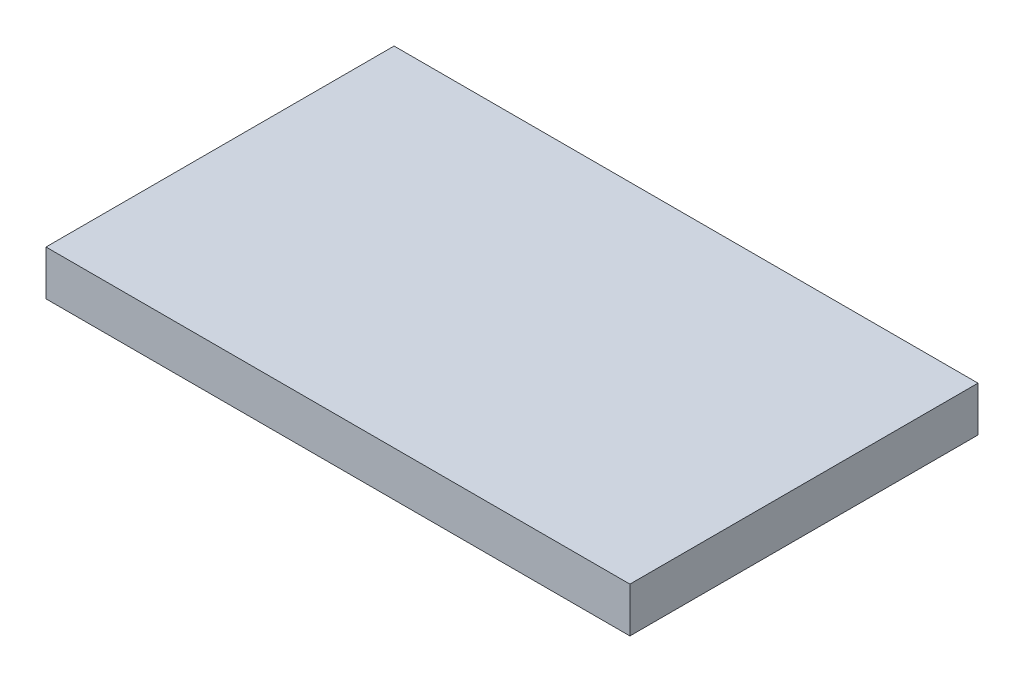
ISO-10303-21;
HEADER;
FILE_DESCRIPTION(('STEP AP214'),'2;1');
FILE_NAME('part.step','',(''),(''),'','','');
FILE_SCHEMA(('AUTOMOTIVE_DESIGN { 1 0 10303 214 1 1 1 1 }'));
ENDSEC;
DATA;
#1=APPLICATION_CONTEXT('core data for automotive mechanical design processes');
#2=APPLICATION_PROTOCOL_DEFINITION('international standard','automotive_design',2000,#1);
#3=PRODUCT_CONTEXT('',#1,'mechanical');
#4=PRODUCT('Part','Part','',(#3));
#5=PRODUCT_RELATED_PRODUCT_CATEGORY('part','',(#4));
#6=PRODUCT_DEFINITION_FORMATION('','',#4);
#7=PRODUCT_DEFINITION_CONTEXT('part definition',#1,'design');
#8=PRODUCT_DEFINITION('design','',#6,#7);
#9=PRODUCT_DEFINITION_SHAPE('','',#8);
#10=(LENGTH_UNIT() NAMED_UNIT(*) SI_UNIT(.MILLI.,.METRE.));
#11=(NAMED_UNIT(*) PLANE_ANGLE_UNIT() SI_UNIT($,.RADIAN.));
#12=(NAMED_UNIT(*) SI_UNIT($,.STERADIAN.) SOLID_ANGLE_UNIT());
#13=UNCERTAINTY_MEASURE_WITH_UNIT(LENGTH_MEASURE(1.E-05),#10,'distance_accuracy_value','');
#14=(GEOMETRIC_REPRESENTATION_CONTEXT(3) GLOBAL_UNCERTAINTY_ASSIGNED_CONTEXT((#13)) GLOBAL_UNIT_ASSIGNED_CONTEXT((#10,
#11,#12)) REPRESENTATION_CONTEXT('',''));
#15=CARTESIAN_POINT('',(0.,0.,0.));
#16=DIRECTION('',(0.,0.,1.));
#17=DIRECTION('',(1.,0.,0.));
#18=AXIS2_PLACEMENT_3D('',#15,#16,#17);
#19=CARTESIAN_POINT('',(13.,2.,-7.75));
#20=DIRECTION('',(-1.,0.,0.));
#21=DIRECTION('',(0.,0.,1.));
#22=AXIS2_PLACEMENT_3D('',#19,#20,#21);
#23=PLANE('',#22);
#24=DIRECTION('',(0.,0.,-1.));
#25=VECTOR('',#24,1.);
#26=CARTESIAN_POINT('',(13.,0.,-7.75));
#27=LINE('',#26,#25);
#28=CARTESIAN_POINT('',(13.,0.,7.75));
#29=VERTEX_POINT('',#28);
#30=CARTESIAN_POINT('',(13.,0.,-7.75));
#31=VERTEX_POINT('',#30);
#32=EDGE_CURVE('E98',#29,#31,#27,.T.);
#33=ORIENTED_EDGE('',*,*,#32,.T.);
#34=DIRECTION('',(0.,-1.,0.));
#35=VECTOR('',#34,1.);
#36=CARTESIAN_POINT('',(13.,2.,-7.75));
#37=LINE('',#36,#35);
#38=CARTESIAN_POINT('',(13.,2.,-7.75));
#39=VERTEX_POINT('',#38);
#40=EDGE_CURVE('E11',#39,#31,#37,.T.);
#41=ORIENTED_EDGE('',*,*,#40,.F.);
#42=DIRECTION('',(0.,0.,-1.));
#43=VECTOR('',#42,1.);
#44=CARTESIAN_POINT('',(13.,2.,-7.75));
#45=LINE('',#44,#43);
#46=CARTESIAN_POINT('',(13.,2.,7.75));
#47=VERTEX_POINT('',#46);
#48=EDGE_CURVE('E86',#47,#39,#45,.T.);
#49=ORIENTED_EDGE('',*,*,#48,.F.);
#50=DIRECTION('',(0.,-1.,0.));
#51=VECTOR('',#50,1.);
#52=CARTESIAN_POINT('',(13.,2.,7.75));
#53=LINE('',#52,#51);
#54=EDGE_CURVE('E94',#47,#29,#53,.T.);
#55=ORIENTED_EDGE('',*,*,#54,.T.);
#56=EDGE_LOOP('',(#33,#41,#49,#55));
#57=FACE_BOUND('',#56,.T.);
#58=ADVANCED_FACE('F35',(#57),#23,.F.);
#59=CARTESIAN_POINT('',(-13.,2.,-7.75));
#60=DIRECTION('',(0.,0.,1.));
#61=DIRECTION('',(1.,0.,0.));
#62=AXIS2_PLACEMENT_3D('',#59,#60,#61);
#63=PLANE('',#62);
#64=DIRECTION('',(-1.,0.,0.));
#65=VECTOR('',#64,1.);
#66=CARTESIAN_POINT('',(-13.,0.,-7.75));
#67=LINE('',#66,#65);
#68=CARTESIAN_POINT('',(-13.,0.,-7.75));
#69=VERTEX_POINT('',#68);
#70=EDGE_CURVE('E90',#31,#69,#67,.T.);
#71=ORIENTED_EDGE('',*,*,#70,.T.);
#72=DIRECTION('',(0.,-1.,0.));
#73=VECTOR('',#72,1.);
#74=CARTESIAN_POINT('',(-13.,2.,-7.75));
#75=LINE('',#74,#73);
#76=CARTESIAN_POINT('',(-13.,2.,-7.75));
#77=VERTEX_POINT('',#76);
#78=EDGE_CURVE('E43',#77,#69,#75,.T.);
#79=ORIENTED_EDGE('',*,*,#78,.F.);
#80=DIRECTION('',(-1.,0.,0.));
#81=VECTOR('',#80,1.);
#82=CARTESIAN_POINT('',(-13.,2.,-7.75));
#83=LINE('',#82,#81);
#84=EDGE_CURVE('E81',#39,#77,#83,.T.);
#85=ORIENTED_EDGE('',*,*,#84,.F.);
#86=ORIENTED_EDGE('',*,*,#40,.T.);
#87=EDGE_LOOP('',(#71,#79,#85,#86));
#88=FACE_BOUND('',#87,.T.);
#89=ADVANCED_FACE('F89',(#88),#63,.F.);
#90=CARTESIAN_POINT('',(-13.,2.,-7.75));
#91=DIRECTION('',(1.,0.,0.));
#92=DIRECTION('',(0.,0.,-1.));
#93=AXIS2_PLACEMENT_3D('',#90,#91,#92);
#94=PLANE('',#93);
#95=DIRECTION('',(0.,0.,1.));
#96=VECTOR('',#95,1.);
#97=CARTESIAN_POINT('',(-13.,0.,-7.75));
#98=LINE('',#97,#96);
#99=CARTESIAN_POINT('',(-13.,0.,7.75));
#100=VERTEX_POINT('',#99);
#101=EDGE_CURVE('E68',#69,#100,#98,.T.);
#102=ORIENTED_EDGE('',*,*,#101,.T.);
#103=DIRECTION('',(0.,-1.,0.));
#104=VECTOR('',#103,1.);
#105=CARTESIAN_POINT('',(-13.,2.,7.75));
#106=LINE('',#105,#104);
#107=CARTESIAN_POINT('',(-13.,2.,7.75));
#108=VERTEX_POINT('',#107);
#109=EDGE_CURVE('E91',#108,#100,#106,.T.);
#110=ORIENTED_EDGE('',*,*,#109,.F.);
#111=DIRECTION('',(0.,0.,1.));
#112=VECTOR('',#111,1.);
#113=CARTESIAN_POINT('',(-13.,2.,-7.75));
#114=LINE('',#113,#112);
#115=EDGE_CURVE('E84',#77,#108,#114,.T.);
#116=ORIENTED_EDGE('',*,*,#115,.F.);
#117=ORIENTED_EDGE('',*,*,#78,.T.);
#118=EDGE_LOOP('',(#102,#110,#116,#117));
#119=FACE_BOUND('',#118,.T.);
#120=ADVANCED_FACE('F92',(#119),#94,.F.);
#121=CARTESIAN_POINT('',(-13.,2.,7.75));
#122=DIRECTION('',(0.,0.,-1.));
#123=DIRECTION('',(-1.,0.,0.));
#124=AXIS2_PLACEMENT_3D('',#121,#122,#123);
#125=PLANE('',#124);
#126=DIRECTION('',(1.,0.,0.));
#127=VECTOR('',#126,1.);
#128=CARTESIAN_POINT('',(-13.,0.,7.75));
#129=LINE('',#128,#127);
#130=EDGE_CURVE('E74',#100,#29,#129,.T.);
#131=ORIENTED_EDGE('',*,*,#130,.T.);
#132=ORIENTED_EDGE('',*,*,#54,.F.);
#133=DIRECTION('',(1.,0.,0.));
#134=VECTOR('',#133,1.);
#135=CARTESIAN_POINT('',(-13.,2.,7.75));
#136=LINE('',#135,#134);
#137=EDGE_CURVE('E51',#108,#47,#136,.T.);
#138=ORIENTED_EDGE('',*,*,#137,.F.);
#139=ORIENTED_EDGE('',*,*,#109,.T.);
#140=EDGE_LOOP('',(#131,#132,#138,#139));
#141=FACE_BOUND('',#140,.T.);
#142=ADVANCED_FACE('F105',(#141),#125,.F.);
#143=CARTESIAN_POINT('',(0.,2.,0.));
#144=DIRECTION('',(0.,1.,0.));
#145=DIRECTION('',(0.,0.,1.));
#146=AXIS2_PLACEMENT_3D('',#143,#144,#145);
#147=PLANE('',#146);
#148=ORIENTED_EDGE('',*,*,#48,.T.);
#149=ORIENTED_EDGE('',*,*,#84,.T.);
#150=ORIENTED_EDGE('',*,*,#115,.T.);
#151=ORIENTED_EDGE('',*,*,#137,.T.);
#152=EDGE_LOOP('',(#148,#149,#150,#151));
#153=FACE_BOUND('',#152,.T.);
#154=ADVANCED_FACE('F82',(#153),#147,.T.);
#155=CARTESIAN_POINT('',(0.,0.,0.));
#156=DIRECTION('',(0.,1.,0.));
#157=DIRECTION('',(0.,0.,1.));
#158=AXIS2_PLACEMENT_3D('',#155,#156,#157);
#159=PLANE('',#158);
#160=ORIENTED_EDGE('',*,*,#32,.F.);
#161=ORIENTED_EDGE('',*,*,#130,.F.);
#162=ORIENTED_EDGE('',*,*,#101,.F.);
#163=ORIENTED_EDGE('',*,*,#70,.F.);
#164=EDGE_LOOP('',(#160,#161,#162,#163));
#165=FACE_BOUND('',#164,.T.);
#166=ADVANCED_FACE('F108',(#165),#159,.F.);
#167=CLOSED_SHELL('',(#58,#89,#120,#142,#154,#166));
#168=MANIFOLD_SOLID_BREP('B2',#167);
#169=ADVANCED_BREP_SHAPE_REPRESENTATION('',(#18,#168),#14);
#170=SHAPE_DEFINITION_REPRESENTATION(#9,#169);
ENDSEC;
END-ISO-10303-21;
